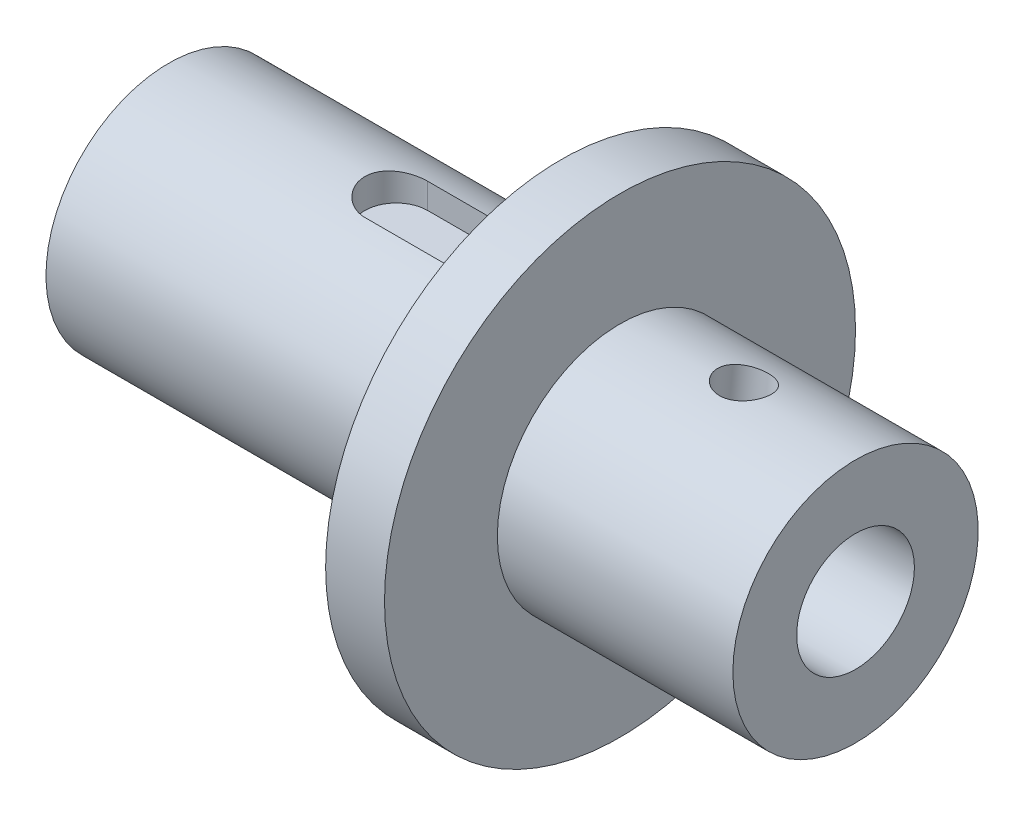
ISO-10303-21;
HEADER;
FILE_DESCRIPTION(('STEP AP214'),'2;1');
FILE_NAME('part.step','',(''),(''),'','','');
FILE_SCHEMA(('AUTOMOTIVE_DESIGN { 1 0 10303 214 1 1 1 1 }'));
ENDSEC;
DATA;
#1=APPLICATION_CONTEXT('core data for automotive mechanical design processes');
#2=APPLICATION_PROTOCOL_DEFINITION('international standard','automotive_design',2000,#1);
#3=PRODUCT_CONTEXT('',#1,'mechanical');
#4=PRODUCT('Part','Part','',(#3));
#5=PRODUCT_RELATED_PRODUCT_CATEGORY('part','',(#4));
#6=PRODUCT_DEFINITION_FORMATION('','',#4);
#7=PRODUCT_DEFINITION_CONTEXT('part definition',#1,'design');
#8=PRODUCT_DEFINITION('design','',#6,#7);
#9=PRODUCT_DEFINITION_SHAPE('','',#8);
#10=(LENGTH_UNIT() NAMED_UNIT(*) SI_UNIT(.MILLI.,.METRE.));
#11=(NAMED_UNIT(*) PLANE_ANGLE_UNIT() SI_UNIT($,.RADIAN.));
#12=(NAMED_UNIT(*) SI_UNIT($,.STERADIAN.) SOLID_ANGLE_UNIT());
#13=UNCERTAINTY_MEASURE_WITH_UNIT(LENGTH_MEASURE(1.E-05),#10,'distance_accuracy_value','');
#14=(GEOMETRIC_REPRESENTATION_CONTEXT(3) GLOBAL_UNCERTAINTY_ASSIGNED_CONTEXT((#13)) GLOBAL_UNIT_ASSIGNED_CONTEXT((#10,
#11,#12)) REPRESENTATION_CONTEXT('',''));
#15=CARTESIAN_POINT('',(0.,0.,0.));
#16=DIRECTION('',(0.,0.,1.));
#17=DIRECTION('',(1.,0.,0.));
#18=AXIS2_PLACEMENT_3D('',#15,#16,#17);
#19=CARTESIAN_POINT('',(12.103012167,0.,0.));
#20=DIRECTION('',(-1.,0.,0.));
#21=DIRECTION('',(0.,-1.,0.));
#22=AXIS2_PLACEMENT_3D('',#19,#20,#21);
#23=CONICAL_SURFACE('',#22,0.,1.02974425859194);
#24=CARTESIAN_POINT('',(12.103012167,0.,0.));
#25=VERTEX_POINT('',#24);
#26=VERTEX_LOOP('',#25);
#27=FACE_BOUND('',#26,.T.);
#28=CARTESIAN_POINT('',(10.,0.,0.));
#29=DIRECTION('',(-1.,0.,0.));
#30=DIRECTION('',(0.,0.,1.));
#31=AXIS2_PLACEMENT_3D('',#28,#29,#30);
#32=CIRCLE('',#31,3.5);
#33=CARTESIAN_POINT('',(10.,0.,3.5));
#34=VERTEX_POINT('',#33);
#35=EDGE_CURVE('E218',#34,#34,#32,.F.);
#36=ORIENTED_EDGE('',*,*,#35,.F.);
#37=EDGE_LOOP('',(#36));
#38=FACE_BOUND('',#37,.T.);
#39=ADVANCED_FACE('F16',(#27,#38),#23,.F.);
#40=CARTESIAN_POINT('',(9.94,4.75,1.6));
#41=DIRECTION('',(0.,-1.,0.));
#42=DIRECTION('',(0.,0.,-1.));
#43=AXIS2_PLACEMENT_3D('',#40,#41,#42);
#44=PLANE('',#43);
#45=CARTESIAN_POINT('',(18.4,4.75,0.));
#46=DIRECTION('',(0.,-1.,0.));
#47=DIRECTION('',(1.,0.,0.));
#48=AXIS2_PLACEMENT_3D('',#45,#46,#47);
#49=CIRCLE('',#48,1.6);
#50=CARTESIAN_POINT('',(18.4,4.75,-1.6));
#51=VERTEX_POINT('',#50);
#52=CARTESIAN_POINT('',(18.3999999996718,4.75,1.6));
#53=VERTEX_POINT('',#52);
#54=EDGE_CURVE('E209',#51,#53,#49,.T.);
#55=ORIENTED_EDGE('',*,*,#54,.F.);
#56=DIRECTION('',(-1.,0.,0.));
#57=VECTOR('',#56,1.);
#58=CARTESIAN_POINT('',(15.,4.75,-1.6));
#59=LINE('',#58,#57);
#60=CARTESIAN_POINT('',(11.5999999998563,4.75,-1.6));
#61=VERTEX_POINT('',#60);
#62=EDGE_CURVE('E60',#51,#61,#59,.T.);
#63=ORIENTED_EDGE('',*,*,#62,.T.);
#64=CARTESIAN_POINT('',(11.6,4.75,0.));
#65=DIRECTION('',(0.,-1.,0.));
#66=DIRECTION('',(1.,0.,0.));
#67=AXIS2_PLACEMENT_3D('',#64,#65,#66);
#68=CIRCLE('',#67,1.6);
#69=CARTESIAN_POINT('',(11.6,4.75,1.6));
#70=VERTEX_POINT('',#69);
#71=EDGE_CURVE('E20',#70,#61,#68,.T.);
#72=ORIENTED_EDGE('',*,*,#71,.F.);
#73=DIRECTION('',(1.,0.,0.));
#74=VECTOR('',#73,1.);
#75=CARTESIAN_POINT('',(15.,4.75,1.6));
#76=LINE('',#75,#74);
#77=EDGE_CURVE('E79',#70,#53,#76,.T.);
#78=ORIENTED_EDGE('',*,*,#77,.T.);
#79=EDGE_LOOP('',(#55,#63,#72,#78));
#80=FACE_BOUND('',#79,.T.);
#81=ADVANCED_FACE('F120',(#80),#44,.F.);
#82=CARTESIAN_POINT('',(10.,0.,0.));
#83=DIRECTION('',(-1.,0.,0.));
#84=DIRECTION('',(0.,-1.,0.));
#85=AXIS2_PLACEMENT_3D('',#82,#83,#84);
#86=CYLINDRICAL_SURFACE('',#85,3.5);
#87=ORIENTED_EDGE('',*,*,#35,.T.);
#88=EDGE_LOOP('',(#87));
#89=FACE_BOUND('',#88,.T.);
#90=CARTESIAN_POINT('',(0.,0.,0.));
#91=DIRECTION('',(-1.,0.,0.));
#92=DIRECTION('',(0.,-1.,0.));
#93=AXIS2_PLACEMENT_3D('',#90,#91,#92);
#94=CIRCLE('',#93,3.5);
#95=CARTESIAN_POINT('',(0.,-3.5,0.));
#96=VERTEX_POINT('',#95);
#97=EDGE_CURVE('E210',#96,#96,#94,.T.);
#98=ORIENTED_EDGE('',*,*,#97,.T.);
#99=EDGE_LOOP('',(#98));
#100=FACE_BOUND('',#99,.T.);
#101=ADVANCED_FACE('F117',(#89,#100),#86,.F.);
#102=CARTESIAN_POINT('',(11.6,4.75,-1.6));
#103=DIRECTION('',(0.,0.,-1.));
#104=DIRECTION('',(0.,1.,0.));
#105=AXIS2_PLACEMENT_3D('',#102,#103,#104);
#106=PLANE('',#105);
#107=DIRECTION('',(0.,1.,0.));
#108=VECTOR('',#107,1.);
#109=CARTESIAN_POINT('',(18.4,5.5045,-1.6));
#110=LINE('',#109,#108);
#111=CARTESIAN_POINT('',(18.4,6.04172988509523,-1.5999999986085));
#112=VERTEX_POINT('',#111);
#113=EDGE_CURVE('E213',#112,#51,#110,.F.);
#114=ORIENTED_EDGE('',*,*,#113,.F.);
#115=DIRECTION('',(1.,0.,0.));
#116=VECTOR('',#115,1.);
#117=CARTESIAN_POINT('',(10.,6.04172988546373,-1.59999999721699));
#118=LINE('',#117,#116);
#119=CARTESIAN_POINT('',(11.5999999998025,6.04172988509523,-1.59999999930425));
#120=VERTEX_POINT('',#119);
#121=EDGE_CURVE('E89',#112,#120,#118,.F.);
#122=ORIENTED_EDGE('',*,*,#121,.T.);
#123=DIRECTION('',(0.,-1.,0.));
#124=VECTOR('',#123,1.);
#125=CARTESIAN_POINT('',(11.5999999997127,5.5045,-1.6));
#126=LINE('',#125,#124);
#127=EDGE_CURVE('E68',#61,#120,#126,.F.);
#128=ORIENTED_EDGE('',*,*,#127,.F.);
#129=ORIENTED_EDGE('',*,*,#62,.F.);
#130=EDGE_LOOP('',(#114,#122,#128,#129));
#131=FACE_BOUND('',#130,.T.);
#132=ADVANCED_FACE('F114',(#131),#106,.F.);
#133=CARTESIAN_POINT('',(11.6,6.259,0.));
#134=DIRECTION('',(0.,-1.,0.));
#135=DIRECTION('',(1.,0.,0.));
#136=AXIS2_PLACEMENT_3D('',#133,#134,#135);
#137=CYLINDRICAL_SURFACE('',#136,1.6);
#138=DIRECTION('',(0.,-1.,0.));
#139=VECTOR('',#138,1.);
#140=CARTESIAN_POINT('',(11.6,5.3958649425,1.6));
#141=LINE('',#140,#139);
#142=CARTESIAN_POINT('',(11.6,6.04172988462339,1.60000000039018));
#143=VERTEX_POINT('',#142);
#144=EDGE_CURVE('E74',#143,#70,#141,.T.);
#145=ORIENTED_EDGE('',*,*,#144,.T.);
#146=ORIENTED_EDGE('',*,*,#71,.T.);
#147=ORIENTED_EDGE('',*,*,#127,.T.);
#148=CARTESIAN_POINT('',(11.5999999998922,6.04172988432471,-1.59999999947766));
#149=CARTESIAN_POINT('',(11.5557761924466,6.04172681998835,-1.60000058063836));
#150=CARTESIAN_POINT('',(11.5115743368598,6.04221606114527,-1.59816531963061));
#151=CARTESIAN_POINT('',(11.423501939716,6.0441475187251,-1.59084948440104));
#152=CARTESIAN_POINT('',(11.3796313417277,6.04558956895065,-1.5853695459149));
#153=CARTESIAN_POINT('',(11.2491787101318,6.05128664570145,-1.56354387092447));
#154=CARTESIAN_POINT('',(11.1634942991287,6.05691296455972,-1.54181191232164));
#155=CARTESIAN_POINT('',(10.9971462253428,6.07116471186792,-1.48469298235488));
#156=CARTESIAN_POINT('',(10.916481951985,6.0797897747514,-1.44930767536543));
#157=CARTESIAN_POINT('',(10.7621921715695,6.09906207670737,-1.3659307828788));
#158=CARTESIAN_POINT('',(10.6885687150988,6.10970990221465,-1.31793553998795));
#159=CARTESIAN_POINT('',(10.5488020061496,6.13210006597814,-1.20953150041553));
#160=CARTESIAN_POINT('',(10.4828447176425,6.14386047186267,-1.14888672792746));
#161=CARTESIAN_POINT('',(10.3619124279948,6.16699526206159,-1.01740759585289));
#162=CARTESIAN_POINT('',(10.3069391915817,6.17836958410342,-0.946571602056747));
#163=CARTESIAN_POINT('',(10.2087712619504,6.19965165002255,-0.795436230713945));
#164=CARTESIAN_POINT('',(10.1657611992738,6.20953543018896,-0.71501326513066));
#165=CARTESIAN_POINT('',(10.0939437435305,6.22651438593658,-0.547787185491661));
#166=CARTESIAN_POINT('',(10.0651334604794,6.23361012888835,-0.4609853738149));
#167=CARTESIAN_POINT('',(10.0231319161723,6.24408566321076,-0.285413561269985));
#168=CARTESIAN_POINT('',(10.0096227210813,6.2475409864945,-0.196724203720504));
#169=CARTESIAN_POINT('',(9.99760793101368,6.25060992112489,-0.0182732189283333));
#170=CARTESIAN_POINT('',(9.99910034460246,6.25022404238376,0.0714882644116628));
#171=CARTESIAN_POINT('',(10.0168200133859,6.24570981389548,0.247323651967181));
#172=CARTESIAN_POINT('',(10.0327036540762,6.24166874175723,0.333434763369542));
#173=CARTESIAN_POINT('',(10.0782014172958,6.23040035198614,0.501725414121636));
#174=CARTESIAN_POINT('',(10.1078161636171,6.22317288959914,0.583904774668287));
#175=CARTESIAN_POINT('',(10.1802086555579,6.2062116261756,0.742896354208404));
#176=CARTESIAN_POINT('',(10.2231072403234,6.19645495612802,0.819651012147));
#177=CARTESIAN_POINT('',(10.3207568884092,6.17549144575384,0.964989633533756));
#178=CARTESIAN_POINT('',(10.375509839934,6.16428437451683,1.0335722926164));
#179=CARTESIAN_POINT('',(10.4971421771756,6.14126503423738,1.16266481600372));
#180=CARTESIAN_POINT('',(10.5643204114643,6.12944461221689,1.22289192620875));
#181=CARTESIAN_POINT('',(10.7079659564706,6.10681624863925,1.33130465043616));
#182=CARTESIAN_POINT('',(10.7844358085888,6.0960085855254,1.37948695895264));
#183=CARTESIAN_POINT('',(10.9450817636181,6.07659665729782,1.46263931350084));
#184=CARTESIAN_POINT('',(11.0293001681628,6.06800559621486,1.49753074830726));
#185=CARTESIAN_POINT('',(11.2026319549541,6.05417058222458,1.55252575213169));
#186=CARTESIAN_POINT('',(11.2917377922956,6.04892161963159,1.57265146137153));
#187=CARTESIAN_POINT('',(11.4180187991308,6.04436067125665,1.59003843258497));
#188=CARTESIAN_POINT('',(11.4543374169817,6.04337571668329,1.59377456081873));
#189=CARTESIAN_POINT('',(11.5270982255903,6.04206057703251,1.59875259411566));
#190=CARTESIAN_POINT('',(11.5635401232575,6.04172934033848,1.59999850515874));
#191=CARTESIAN_POINT('',(11.6000000000159,6.04172988472672,1.6));
#192=B_SPLINE_CURVE_WITH_KNOTS('',3,(#148,#149,#150,#151,#152,#153,#154,#155,#156,#157,#158,
#159,#160,#161,#162,#163,#164,#165,#166,#167,#168,#169,#170,#171,#172,#173,#174,#175,#176,#177,
#178,#179,#180,#181,#182,#183,#184,#185,#186,#187,#188,#189,#190,#191),.UNSPECIFIED.,.F.,.F.,(4,
2,2,2,2,2,2,2,2,2,2,2,2,2,2,2,2,2,2,2,2,4),(0.,0.132587489921271,0.26515185886682,
0.529506235632429,0.793828397169026,1.05822730766522,1.32808864549373,1.59799330517167,
1.87185763919818,2.14566621244113,2.41367462580973,2.68164746204973,2.9433858988442,
3.20513622734869,3.46934127251113,3.73358843217079,4.00529978668743,4.27708562644268,
4.55045491352495,4.82341345913667,4.9329108850557,5.04223202166154),.UNSPECIFIED.);
#193=EDGE_CURVE('E83',#120,#143,#192,.T.);
#194=ORIENTED_EDGE('',*,*,#193,.T.);
#195=EDGE_LOOP('',(#145,#146,#147,#194));
#196=FACE_BOUND('',#195,.T.);
#197=ADVANCED_FACE('F88',(#196),#137,.F.);
#198=CARTESIAN_POINT('',(11.6,6.041729885,1.6));
#199=DIRECTION('',(0.,0.,1.));
#200=DIRECTION('',(0.,-1.,0.));
#201=AXIS2_PLACEMENT_3D('',#198,#199,#200);
#202=PLANE('',#201);
#203=DIRECTION('',(0.,-1.,0.));
#204=VECTOR('',#203,1.);
#205=CARTESIAN_POINT('',(18.3999999993437,5.5045,1.6));
#206=LINE('',#205,#204);
#207=CARTESIAN_POINT('',(18.3999999995488,6.04172988462339,1.60000000019509));
#208=VERTEX_POINT('',#207);
#209=EDGE_CURVE('E208',#53,#208,#206,.F.);
#210=ORIENTED_EDGE('',*,*,#209,.F.);
#211=ORIENTED_EDGE('',*,*,#77,.F.);
#212=ORIENTED_EDGE('',*,*,#144,.F.);
#213=DIRECTION('',(-1.,0.,0.));
#214=VECTOR('',#213,1.);
#215=CARTESIAN_POINT('',(10.,6.04172988452006,1.60000000078037));
#216=LINE('',#215,#214);
#217=EDGE_CURVE('E78',#143,#208,#216,.F.);
#218=ORIENTED_EDGE('',*,*,#217,.T.);
#219=EDGE_LOOP('',(#210,#211,#212,#218));
#220=FACE_BOUND('',#219,.T.);
#221=ADVANCED_FACE('F77',(#220),#202,.F.);
#222=CARTESIAN_POINT('',(18.4,6.259,0.));
#223=DIRECTION('',(0.,-1.,0.));
#224=DIRECTION('',(1.,0.,0.));
#225=AXIS2_PLACEMENT_3D('',#222,#223,#224);
#226=CYLINDRICAL_SURFACE('',#225,1.6);
#227=ORIENTED_EDGE('',*,*,#209,.T.);
#228=CARTESIAN_POINT('',(18.3999999997539,6.04172988472672,1.6));
#229=CARTESIAN_POINT('',(18.4442252437646,6.04172681935809,1.60000058071497));
#230=CARTESIAN_POINT('',(18.4884285361978,6.04221609265232,1.59816520019615));
#231=CARTESIAN_POINT('',(18.5765037702702,6.04414767535478,1.59084889079733));
#232=CARTESIAN_POINT('',(18.6203757683835,6.04558981844555,1.58536859811283));
#233=CARTESIAN_POINT('',(18.750826867573,6.05128701027557,1.56354245695758));
#234=CARTESIAN_POINT('',(18.8365084072781,6.05691319634807,1.54181097336296));
#235=CARTESIAN_POINT('',(19.0028525068043,6.07116460332659,1.48469342735641));
#236=CARTESIAN_POINT('',(19.083515590497,6.07978951057769,1.44930879297));
#237=CARTESIAN_POINT('',(19.2378056000443,6.0990617555275,1.36593219746827));
#238=CARTESIAN_POINT('',(19.3114302615877,6.10970974079581,1.31793619767597));
#239=CARTESIAN_POINT('',(19.4511969337215,6.13209989358457,1.2095324614657));
#240=CARTESIAN_POINT('',(19.5171532493549,6.14386010192705,1.14888910437424));
#241=CARTESIAN_POINT('',(19.6380860433759,6.16699495092037,1.01740909159002));
#242=CARTESIAN_POINT('',(19.6930604344795,6.17836951793369,0.946570502529934));
#243=CARTESIAN_POINT('',(19.7912427639658,6.19965467561516,0.795416337254771));
#244=CARTESIAN_POINT('',(19.8342624974552,6.20954083631325,0.714974907464192));
#245=CARTESIAN_POINT('',(19.9060744713592,6.22651889069355,0.547727959551473));
#246=CARTESIAN_POINT('',(19.9348778502541,6.23361297107836,0.460927485162236));
#247=CARTESIAN_POINT('',(19.9706552481646,6.24253611579442,0.311391289185376));
#248=CARTESIAN_POINT('',(19.9816419953275,6.24531855883619,0.249642895903449));
#249=CARTESIAN_POINT('',(19.9963191885434,6.24905766568499,0.125274030424995));
#250=CARTESIAN_POINT('',(20.0000145519229,6.25001555995694,0.0626541746654029));
#251=CARTESIAN_POINT('',(20.,6.25,-6.40947607685294E-10));
#252=B_SPLINE_CURVE_WITH_KNOTS('',3,(#228,#229,#230,#231,#232,#233,#234,#235,#236,#237,#238,
#239,#240,#241,#242,#243,#244,#245,#246,#247,#248,#249,#250,#251),.UNSPECIFIED.,.F.,.F.,(4,2,2,
2,2,2,2,2,2,2,2,4),(0.,0.132591796333495,0.26516045571009,0.529506258667722,0.793824420367086,
1.05822733097571,1.32808470876535,1.59799332840719,1.87193727334603,2.14566624178149,
2.33357502637954,2.52135704147259),.UNSPECIFIED.);
#253=CARTESIAN_POINT('',(20.,6.25,-6.40946634980567E-10));
#254=VERTEX_POINT('',#253);
#255=EDGE_CURVE('E86',#208,#254,#252,.T.);
#256=ORIENTED_EDGE('',*,*,#255,.T.);
#257=CARTESIAN_POINT('',(20.,6.25,-6.40946683968078E-10));
#258=CARTESIAN_POINT('',(20.0000005161681,6.2500025791623,-0.0442493130808318));
#259=CARTESIAN_POINT('',(19.9981631980636,6.24952950560536,-0.0884767546108638));
#260=CARTESIAN_POINT('',(19.990838751429,6.24765951576339,-0.176601659652955));
#261=CARTESIAN_POINT('',(19.9853522086805,6.24626274775206,-0.220499174981966));
#262=CARTESIAN_POINT('',(19.9634989956066,6.24073855860704,-0.351035894575359));
#263=CARTESIAN_POINT('',(19.9417383857182,6.235276934396,-0.436779327251071));
#264=CARTESIAN_POINT('',(19.8845361180179,6.22138142052395,-0.603250781418871));
#265=CARTESIAN_POINT('',(19.8490950401602,6.21294765686175,-0.683979015351177));
#266=CARTESIAN_POINT('',(19.7655864191011,6.1940032883892,-0.838377146237586));
#267=CARTESIAN_POINT('',(19.7175153453696,6.18349210306995,-0.912045061712377));
#268=CARTESIAN_POINT('',(19.609034125669,6.16128215439174,-1.05176517817468));
#269=CARTESIAN_POINT('',(19.5484053131104,6.1495645034444,-1.11764452045923));
#270=CARTESIAN_POINT('',(19.416986407459,6.12638439341584,-1.23842820687321));
#271=CARTESIAN_POINT('',(19.3461940342909,6.1149219922652,-1.29333008170652));
#272=CARTESIAN_POINT('',(19.1950844491892,6.09335592126694,-1.39143271986651));
#273=CARTESIAN_POINT('',(19.1146333562695,6.08327683202516,-1.43443293963199));
#274=CARTESIAN_POINT('',(18.9473677047683,6.06590612988119,-1.50620531479238));
#275=CARTESIAN_POINT('',(18.8605584454515,6.05861222645372,-1.53498916741076));
#276=CARTESIAN_POINT('',(18.7110751833261,6.04942831864308,-1.57071499156498));
#277=CARTESIAN_POINT('',(18.6493929452108,6.04656033773115,-1.58167872257819));
#278=CARTESIAN_POINT('',(18.5251517747055,6.04270282468231,-1.59632635000043));
#279=CARTESIAN_POINT('',(18.4625934004119,6.04171214704809,-1.60001468578339));
#280=CARTESIAN_POINT('',(18.400000000101,6.04172988472672,-1.6));
#281=B_SPLINE_CURVE_WITH_KNOTS('',3,(#257,#258,#259,#260,#261,#262,#263,#264,#265,#266,#267,
#268,#269,#270,#271,#272,#273,#274,#275,#276,#277,#278,#279,#280),.UNSPECIFIED.,.F.,.F.,(4,2,2,
2,2,2,2,2,2,2,2,4),(0.,0.132664225363,0.265307160306465,0.529823039695571,0.794327706731223,
1.05890639098156,1.32855180997544,1.59825781554553,1.87226450230523,2.14604535927402,
2.3337582977726,2.52135666022402),.UNSPECIFIED.);
#282=EDGE_CURVE('E91',#254,#112,#281,.T.);
#283=ORIENTED_EDGE('',*,*,#282,.T.);
#284=ORIENTED_EDGE('',*,*,#113,.T.);
#285=ORIENTED_EDGE('',*,*,#54,.T.);
#286=EDGE_LOOP('',(#227,#256,#283,#284,#285));
#287=FACE_BOUND('',#286,.T.);
#288=ADVANCED_FACE('F115',(#287),#226,.F.);
#289=CARTESIAN_POINT('',(0.,-6.325,6.325));
#290=DIRECTION('',(1.,0.,0.));
#291=DIRECTION('',(0.,0.,-1.));
#292=AXIS2_PLACEMENT_3D('',#289,#290,#291);
#293=PLANE('',#292);
#294=ORIENTED_EDGE('',*,*,#97,.F.);
#295=EDGE_LOOP('',(#294));
#296=FACE_BOUND('',#295,.T.);
#297=CARTESIAN_POINT('',(0.,0.,0.));
#298=DIRECTION('',(-1.,0.,0.));
#299=DIRECTION('',(0.,-1.,0.));
#300=AXIS2_PLACEMENT_3D('',#297,#298,#299);
#301=CIRCLE('',#300,6.25);
#302=CARTESIAN_POINT('',(0.,-6.25000000000001,0.));
#303=VERTEX_POINT('',#302);
#304=EDGE_CURVE('E201',#303,#303,#301,.T.);
#305=ORIENTED_EDGE('',*,*,#304,.T.);
#306=EDGE_LOOP('',(#305));
#307=FACE_BOUND('',#306,.T.);
#308=ADVANCED_FACE('F131',(#296,#307),#293,.F.);
#309=CARTESIAN_POINT('',(20.,0.,0.));
#310=DIRECTION('',(-1.,0.,0.));
#311=DIRECTION('',(0.,-1.,0.));
#312=AXIS2_PLACEMENT_3D('',#309,#310,#311);
#313=CYLINDRICAL_SURFACE('',#312,6.25);
#314=ORIENTED_EDGE('',*,*,#304,.F.);
#315=EDGE_LOOP('',(#314));
#316=FACE_BOUND('',#315,.T.);
#317=CARTESIAN_POINT('',(20.,0.,0.));
#318=DIRECTION('',(-1.,0.,0.));
#319=DIRECTION('',(0.,-1.,0.));
#320=AXIS2_PLACEMENT_3D('',#317,#318,#319);
#321=CIRCLE('',#320,6.25);
#322=EDGE_CURVE('E35',#254,#254,#321,.T.);
#323=ORIENTED_EDGE('',*,*,#322,.T.);
#324=ORIENTED_EDGE('',*,*,#255,.F.);
#325=ORIENTED_EDGE('',*,*,#217,.F.);
#326=ORIENTED_EDGE('',*,*,#193,.F.);
#327=ORIENTED_EDGE('',*,*,#121,.F.);
#328=ORIENTED_EDGE('',*,*,#282,.F.);
#329=EDGE_LOOP('',(#323,#324,#325,#326,#327,#328));
#330=FACE_BOUND('',#329,.T.);
#331=ADVANCED_FACE('F81',(#316,#330),#313,.T.);
#332=CARTESIAN_POINT('',(20.,-12.144,12.144));
#333=DIRECTION('',(1.,0.,0.));
#334=DIRECTION('',(0.,0.,-1.));
#335=AXIS2_PLACEMENT_3D('',#332,#333,#334);
#336=PLANE('',#335);
#337=ORIENTED_EDGE('',*,*,#322,.F.);
#338=EDGE_LOOP('',(#337));
#339=FACE_BOUND('',#338,.T.);
#340=CARTESIAN_POINT('',(20.,0.,0.));
#341=DIRECTION('',(-1.,0.,0.));
#342=DIRECTION('',(0.,0.,1.));
#343=AXIS2_PLACEMENT_3D('',#340,#341,#342);
#344=CIRCLE('',#343,12.);
#345=CARTESIAN_POINT('',(20.,0.,12.));
#346=VERTEX_POINT('',#345);
#347=EDGE_CURVE('E189',#346,#346,#344,.T.);
#348=ORIENTED_EDGE('',*,*,#347,.T.);
#349=EDGE_LOOP('',(#348));
#350=FACE_BOUND('',#349,.T.);
#351=ADVANCED_FACE('F135',(#339,#350),#336,.F.);
#352=CARTESIAN_POINT('',(23.,0.,0.));
#353=DIRECTION('',(-1.,0.,0.));
#354=DIRECTION('',(0.,0.,1.));
#355=AXIS2_PLACEMENT_3D('',#352,#353,#354);
#356=CYLINDRICAL_SURFACE('',#355,12.);
#357=ORIENTED_EDGE('',*,*,#347,.F.);
#358=EDGE_LOOP('',(#357));
#359=FACE_BOUND('',#358,.T.);
#360=CARTESIAN_POINT('',(23.,0.,0.));
#361=DIRECTION('',(-1.,0.,0.));
#362=DIRECTION('',(0.,0.,1.));
#363=AXIS2_PLACEMENT_3D('',#360,#361,#362);
#364=CIRCLE('',#363,12.);
#365=CARTESIAN_POINT('',(23.,0.,12.));
#366=VERTEX_POINT('',#365);
#367=EDGE_CURVE('E192',#366,#366,#364,.T.);
#368=ORIENTED_EDGE('',*,*,#367,.T.);
#369=EDGE_LOOP('',(#368));
#370=FACE_BOUND('',#369,.T.);
#371=ADVANCED_FACE('F138',(#359,#370),#356,.T.);
#372=CARTESIAN_POINT('',(19.,-3.036,3.036));
#373=DIRECTION('',(1.,0.,0.));
#374=DIRECTION('',(0.,0.,-1.));
#375=AXIS2_PLACEMENT_3D('',#372,#373,#374);
#376=PLANE('',#375);
#377=CARTESIAN_POINT('',(19.,0.,0.));
#378=DIRECTION('',(1.,0.,0.));
#379=DIRECTION('',(0.,0.,-1.));
#380=AXIS2_PLACEMENT_3D('',#377,#378,#379);
#381=CIRCLE('',#380,3.);
#382=CARTESIAN_POINT('',(19.,0.,-3.));
#383=VERTEX_POINT('',#382);
#384=EDGE_CURVE('E193',#383,#383,#381,.F.);
#385=ORIENTED_EDGE('',*,*,#384,.F.);
#386=EDGE_LOOP('',(#385));
#387=FACE_BOUND('',#386,.T.);
#388=ADVANCED_FACE('F140',(#387),#376,.T.);
#389=CARTESIAN_POINT('',(23.,-12.144,-12.144));
#390=DIRECTION('',(-1.,0.,0.));
#391=DIRECTION('',(0.,0.,1.));
#392=AXIS2_PLACEMENT_3D('',#389,#390,#391);
#393=PLANE('',#392);
#394=CARTESIAN_POINT('',(23.,0.,0.));
#395=DIRECTION('',(-1.,0.,0.));
#396=DIRECTION('',(0.,0.,1.));
#397=AXIS2_PLACEMENT_3D('',#394,#395,#396);
#398=CIRCLE('',#397,6.25);
#399=CARTESIAN_POINT('',(23.,0.,6.25));
#400=VERTEX_POINT('',#399);
#401=EDGE_CURVE('E332',#400,#400,#398,.T.);
#402=ORIENTED_EDGE('',*,*,#401,.T.);
#403=EDGE_LOOP('',(#402));
#404=FACE_BOUND('',#403,.T.);
#405=ORIENTED_EDGE('',*,*,#367,.F.);
#406=EDGE_LOOP('',(#405));
#407=FACE_BOUND('',#406,.T.);
#408=ADVANCED_FACE('F142',(#404,#407),#393,.F.);
#409=CARTESIAN_POINT('',(35.,-6.325,-6.325));
#410=DIRECTION('',(-1.,0.,0.));
#411=DIRECTION('',(0.,0.,1.));
#412=AXIS2_PLACEMENT_3D('',#409,#410,#411);
#413=PLANE('',#412);
#414=CARTESIAN_POINT('',(35.,0.,0.));
#415=DIRECTION('',(1.,0.,0.));
#416=DIRECTION('',(0.,0.,-1.));
#417=AXIS2_PLACEMENT_3D('',#414,#415,#416);
#418=CIRCLE('',#417,3.);
#419=CARTESIAN_POINT('',(35.,0.,-3.));
#420=VERTEX_POINT('',#419);
#421=EDGE_CURVE('E196',#420,#420,#418,.T.);
#422=ORIENTED_EDGE('',*,*,#421,.F.);
#423=EDGE_LOOP('',(#422));
#424=FACE_BOUND('',#423,.T.);
#425=CARTESIAN_POINT('',(35.,0.,0.));
#426=DIRECTION('',(-1.,0.,0.));
#427=DIRECTION('',(0.,0.,1.));
#428=AXIS2_PLACEMENT_3D('',#425,#426,#427);
#429=CIRCLE('',#428,6.25);
#430=CARTESIAN_POINT('',(35.,0.,6.25));
#431=VERTEX_POINT('',#430);
#432=EDGE_CURVE('E177',#431,#431,#429,.F.);
#433=ORIENTED_EDGE('',*,*,#432,.T.);
#434=EDGE_LOOP('',(#433));
#435=FACE_BOUND('',#434,.T.);
#436=ADVANCED_FACE('F18',(#424,#435),#413,.F.);
#437=CARTESIAN_POINT('',(19.,0.,0.));
#438=DIRECTION('',(1.,0.,0.));
#439=DIRECTION('',(0.,0.,-1.));
#440=AXIS2_PLACEMENT_3D('',#437,#438,#439);
#441=CYLINDRICAL_SURFACE('',#440,3.);
#442=ORIENTED_EDGE('',*,*,#384,.T.);
#443=EDGE_LOOP('',(#442));
#444=FACE_BOUND('',#443,.T.);
#445=ORIENTED_EDGE('',*,*,#421,.T.);
#446=EDGE_LOOP('',(#445));
#447=FACE_BOUND('',#446,.T.);
#448=CARTESIAN_POINT('',(28.6729558909102,2.84215465608728,0.960290014653018));
#449=CARTESIAN_POINT('',(28.6062119804907,2.84215858822566,0.960285433220162));
#450=CARTESIAN_POINT('',(28.5394113486349,2.84406667022996,0.954687509490999));
#451=CARTESIAN_POINT('',(28.4077958107473,2.8513970128495,0.932557416886779));
#452=CARTESIAN_POINT('',(28.3429839619859,2.8568244253813,0.916009217271825));
#453=CARTESIAN_POINT('',(28.2174027141767,2.87031840196038,0.872799066031478));
#454=CARTESIAN_POINT('',(28.1566196481407,2.87837542906939,0.846173607147348));
#455=CARTESIAN_POINT('',(28.0402148421802,2.89598922742281,0.783768973547764));
#456=CARTESIAN_POINT('',(27.984593532075,2.90554612338329,0.747989037469443));
#457=CARTESIAN_POINT('',(27.8766279416612,2.9254530245957,0.666031423722757));
#458=CARTESIAN_POINT('',(27.8246444470892,2.93581738989922,0.619381773422013));
#459=CARTESIAN_POINT('',(27.7287524749112,2.95535930317042,0.518175772363154));
#460=CARTESIAN_POINT('',(27.6848465137054,2.96453648102927,0.463616967092414));
#461=CARTESIAN_POINT('',(27.6045066077753,2.98067660010954,0.345362234033525));
#462=CARTESIAN_POINT('',(27.5684797143612,2.98752614000877,0.281372494057642));
#463=CARTESIAN_POINT('',(27.5076801865288,2.99709343140407,0.147962567232947));
#464=CARTESIAN_POINT('',(27.4829026972951,2.99981296644382,0.0785447381321278));
#465=CARTESIAN_POINT('',(27.4466164410709,3.00015902285688,-0.0598414434043309));
#466=CARTESIAN_POINT('',(27.434484209355,2.99804324755762,-0.128645152692184));
#467=CARTESIAN_POINT('',(27.4218182509916,2.9888992444619,-0.266980431842222));
#468=CARTESIAN_POINT('',(27.4212798330744,2.98187300480238,-0.336511695914921));
#469=CARTESIAN_POINT('',(27.4314901718976,2.96369893334821,-0.469832638344438));
#470=CARTESIAN_POINT('',(27.4415539924137,2.95282796333234,-0.53371421169309));
#471=CARTESIAN_POINT('',(27.4715090056532,2.92755359000028,-0.658390141048438));
#472=CARTESIAN_POINT('',(27.4914009185844,2.91314992784556,-0.719184270445552));
#473=CARTESIAN_POINT('',(27.5406843396609,2.88149249648658,-0.83713193845086));
#474=CARTESIAN_POINT('',(27.5702163062125,2.86419855443428,-0.894215686298143));
#475=CARTESIAN_POINT('',(27.6378029928525,2.82809842786277,-1.0025592263255));
#476=CARTESIAN_POINT('',(27.6758604367593,2.80929176127431,-1.05381714929671));
#477=CARTESIAN_POINT('',(27.7625322362133,2.77014088071534,-1.15297795458392));
#478=CARTESIAN_POINT('',(27.811701005601,2.74978159512894,-1.20039095320854));
#479=CARTESIAN_POINT('',(27.9176531867181,2.7105184868884,-1.28659980541246));
#480=CARTESIAN_POINT('',(27.9744415037945,2.69161561429534,-1.32539006470657));
#481=CARTESIAN_POINT('',(28.0963934897376,2.65644609081584,-1.39458013002586));
#482=CARTESIAN_POINT('',(28.1617739525585,2.64028892472468,-1.42465544283669));
#483=CARTESIAN_POINT('',(28.2975522448878,2.61329485161351,-1.47359531373276));
#484=CARTESIAN_POINT('',(28.3679388094926,2.60244640704657,-1.49248420245454));
#485=CARTESIAN_POINT('',(28.4780244311362,2.59093723915577,-1.51231643809409));
#486=CARTESIAN_POINT('',(28.5167571950188,2.58788488566508,-1.51752038889922));
#487=CARTESIAN_POINT('',(28.5946387631578,2.58379616559371,-1.52447157634706));
#488=CARTESIAN_POINT('',(28.6337875597828,2.58275976209752,-1.52621887628701));
#489=CARTESIAN_POINT('',(28.7396998009334,2.58276736790079,-1.52621305046791));
#490=CARTESIAN_POINT('',(28.8065004327464,2.5857897430966,-1.5211294716426));
#491=CARTESIAN_POINT('',(28.9381159706657,2.59752976692979,-1.50098879778315));
#492=CARTESIAN_POINT('',(29.0029278195021,2.60625576520001,-1.48591708049005));
#493=CARTESIAN_POINT('',(29.1285090672462,2.62837750429812,-1.44642235638458));
#494=CARTESIAN_POINT('',(29.1892921331422,2.64175638165699,-1.42203308822571));
#495=CARTESIAN_POINT('',(29.3056969391692,2.67187085812785,-1.36460746253179));
#496=CARTESIAN_POINT('',(29.3613182494802,2.6886067364115,-1.33157038576632));
#497=CARTESIAN_POINT('',(29.4692838399144,2.72500055393506,-1.25548605627413));
#498=CARTESIAN_POINT('',(29.5212673342776,2.74476995620865,-1.21197995673558));
#499=CARTESIAN_POINT('',(29.6171593065412,2.78477938932256,-1.11698634492599));
#500=CARTESIAN_POINT('',(29.6610652680421,2.80501956461857,-1.06549635460293));
#501=CARTESIAN_POINT('',(29.7414051740428,2.84521919742437,-0.953118977723232));
#502=CARTESIAN_POINT('',(29.7774320672057,2.86512833622683,-0.891920699707012));
#503=CARTESIAN_POINT('',(29.8382315951671,2.90202459647107,-0.763357844908634));
#504=CARTESIAN_POINT('',(29.8630090847806,2.91901297643087,-0.695995943221681));
#505=CARTESIAN_POINT('',(29.8992953410754,2.94791361108168,-0.56066077297701));
#506=CARTESIAN_POINT('',(29.9114275725158,2.96004403919675,-0.492901790981221));
#507=CARTESIAN_POINT('',(29.9240935309902,2.97964843853057,-0.355657738996826));
#508=CARTESIAN_POINT('',(29.924631949294,2.98712429196682,-0.286173378552608));
#509=CARTESIAN_POINT('',(29.9144216105274,2.99685812170922,-0.151971951139613));
#510=CARTESIAN_POINT('',(29.9043577897257,2.99940596523764,-0.0872221102767034));
#511=CARTESIAN_POINT('',(29.8744027765475,3.00040809360937,0.0399858968212088));
#512=CARTESIAN_POINT('',(29.8545108639635,2.99886207841639,0.10244389474838));
#513=CARTESIAN_POINT('',(29.8052274429725,2.99222991171951,0.224385928973072));
#514=CARTESIAN_POINT('',(29.7756954761521,2.98709004795879,0.283809968589804));
#515=CARTESIAN_POINT('',(29.7081087895465,2.97412861048768,0.397271605097283));
#516=CARTESIAN_POINT('',(29.6700513459431,2.96630617929464,0.451307472521226));
#517=CARTESIAN_POINT('',(29.5833795466066,2.94846441538014,0.55641374358339));
#518=CARTESIAN_POINT('',(29.5342107769974,2.93832922667099,0.607007921854334));
#519=CARTESIAN_POINT('',(29.4282585959004,2.91770445052919,0.699464270977312));
#520=CARTESIAN_POINT('',(29.3714702790657,2.90721463807689,0.741320771907988));
#521=CARTESIAN_POINT('',(29.2495182932197,2.8870827383604,0.816279875024213));
#522=CARTESIAN_POINT('',(29.1841378302401,2.87748080524495,0.849042373657428));
#523=CARTESIAN_POINT('',(29.0483595378955,2.86116881900309,0.902499927595118));
#524=CARTESIAN_POINT('',(28.9779729734339,2.8544524984334,0.92322117094949));
#525=CARTESIAN_POINT('',(28.8678873515555,2.84728438146798,0.945001818583857));
#526=CARTESIAN_POINT('',(28.8291545873923,2.84537181050758,0.950723709520437));
#527=CARTESIAN_POINT('',(28.7512730187449,2.84280580556762,0.958369117073739));
#528=CARTESIAN_POINT('',(28.7121242218921,2.84215234853148,0.960292703244041));
#529=CARTESIAN_POINT('',(28.6729558909102,2.84215465608728,0.960290014653018));
#530=B_SPLINE_CURVE_WITH_KNOTS('',3,(#448,#449,#450,#451,#452,#453,#454,#455,#456,#457,#458,
#459,#460,#461,#462,#463,#464,#465,#466,#467,#468,#469,#470,#471,#472,#473,#474,#475,#476,#477,
#478,#479,#480,#481,#482,#483,#484,#485,#486,#487,#488,#489,#490,#491,#492,#493,#494,#495,#496,
#497,#498,#499,#500,#501,#502,#503,#504,#505,#506,#507,#508,#509,#510,#511,#512,#513,#514,#515,
#516,#517,#518,#519,#520,#521,#522,#523,#524,#525,#526,#527,#528,#529),.UNSPECIFIED.,.T.,.F.,(4,
2,2,2,2,2,2,2,2,2,2,2,2,2,2,2,2,2,2,2,2,2,2,2,2,2,2,2,2,2,2,2,2,2,2,2,2,2,2,2,4),(0.,
0.200076795829988,0.400447145543111,0.600098731677161,0.799766927907044,1.01067616414345,
1.2216509942442,1.44178337131826,1.66182065710738,1.87040592912353,2.07890679852732,
2.27471843430028,2.47054442137914,2.66936150467123,2.86824219917374,3.08111744093762,
3.29413039200628,3.51427696364729,3.73394293778636,3.85135915703463,3.96877322616936,
4.16885002194111,4.36922037157845,4.56887195767876,4.76854015389939,4.97944939014014,
5.19042422023043,5.41055659736437,5.63059388321998,5.83917915532133,6.04768002480758,
6.24349166061696,6.43931764773335,6.63813473101648,6.83701542550783,7.04989066724726,
7.2629036182982,7.48305018996674,7.70271616412248,7.82013238410018,7.93754645396235),.UNSPECIFIED.);
#531=CARTESIAN_POINT('',(28.6729558909102,2.84215465608728,0.960290014653018));
#532=VERTEX_POINT('',#531);
#533=EDGE_CURVE('E26',#532,#532,#530,.T.);
#534=ORIENTED_EDGE('',*,*,#533,.F.);
#535=EDGE_LOOP('',(#534));
#536=FACE_BOUND('',#535,.T.);
#537=ADVANCED_FACE('F150',(#444,#447,#536),#441,.F.);
#538=CARTESIAN_POINT('',(35.,0.,0.));
#539=DIRECTION('',(-1.,0.,0.));
#540=DIRECTION('',(0.,0.,1.));
#541=AXIS2_PLACEMENT_3D('',#538,#539,#540);
#542=CYLINDRICAL_SURFACE('',#541,6.25);
#543=ORIENTED_EDGE('',*,*,#401,.F.);
#544=EDGE_LOOP('',(#543));
#545=FACE_BOUND('',#544,.T.);
#546=ORIENTED_EDGE('',*,*,#432,.F.);
#547=EDGE_LOOP('',(#546));
#548=FACE_BOUND('',#547,.T.);
#549=CARTESIAN_POINT('',(28.6729558904872,5.96097670487534,-1.87863160942574));
#550=CARTESIAN_POINT('',(28.6035728337542,5.96097877392971,-1.87862846752274));
#551=CARTESIAN_POINT('',(28.5341035421025,5.962765388252,-1.87298492584018));
#552=CARTESIAN_POINT('',(28.3970745826972,5.9697643699761,-1.85055284708025));
#553=CARTESIAN_POINT('',(28.3295189814807,5.9749835339135,-1.83374219818178));
#554=CARTESIAN_POINT('',(28.1984025389616,5.988386291605,-1.78948597965667));
#555=CARTESIAN_POINT('',(28.1348360524548,5.99656558001125,-1.76205585149239));
#556=CARTESIAN_POINT('',(28.013346002293,6.01520550490922,-1.69733071362783));
#557=CARTESIAN_POINT('',(27.9554206024811,6.02566539545708,-1.66003892865078));
#558=CARTESIAN_POINT('',(27.846006273283,6.04818692812678,-1.57602198579944));
#559=CARTESIAN_POINT('',(27.794609187725,6.06026735327861,-1.52918222649595));
#560=CARTESIAN_POINT('',(27.7005112018406,6.08500227643305,-1.42757708457724));
#561=CARTESIAN_POINT('',(27.6578113730855,6.09765684494013,-1.37281072676214));
#562=CARTESIAN_POINT('',(27.5819707177568,6.12273595757448,-1.2562575343289));
#563=CARTESIAN_POINT('',(27.5489162212954,6.1351575455124,-1.19441380520673));
#564=CARTESIAN_POINT('',(27.4938620299058,6.15880625208377,-1.06577515713933));
#565=CARTESIAN_POINT('',(27.471861206896,6.17003349251402,-0.998980744234405));
#566=CARTESIAN_POINT('',(27.4398219119737,6.19047444471167,-0.863234176871984));
#567=CARTESIAN_POINT('',(27.4296296845136,6.19971273143429,-0.794322034718324));
#568=CARTESIAN_POINT('',(27.4210171988316,6.21592255191524,-0.655505717562677));
#569=CARTESIAN_POINT('',(27.4225958244599,6.22289430052849,-0.585601637246809));
#570=CARTESIAN_POINT('',(27.4373635872657,6.23431222198247,-0.44784238767997));
#571=CARTESIAN_POINT('',(27.4503870091056,6.2387929575947,-0.379972216612542));
#572=CARTESIAN_POINT('',(27.4874120046779,6.24546435014193,-0.247179658901579));
#573=CARTESIAN_POINT('',(27.5114141004752,6.24765489815619,-0.18225741260105));
#574=CARTESIAN_POINT('',(27.5698695002663,6.2500596109647,-0.0567661385311822));
#575=CARTESIAN_POINT('',(27.6043880499874,6.25026116734495,0.00377270582826845));
#576=CARTESIAN_POINT('',(27.6828455440276,6.24914193743585,0.118383043553365));
#577=CARTESIAN_POINT('',(27.7267848815076,6.24782108760136,0.172454266856874));
#578=CARTESIAN_POINT('',(27.8237372481211,6.24422054091728,0.273524275531053));
#579=CARTESIAN_POINT('',(27.8768937311088,6.2419246961012,0.320384963060393));
#580=CARTESIAN_POINT('',(27.9903267231377,6.2370360299677,0.404555864246496));
#581=CARTESIAN_POINT('',(28.0506063821397,6.23444307728082,0.441861829409832));
#582=CARTESIAN_POINT('',(28.1767911748534,6.22957855843039,0.505853686131683));
#583=CARTESIAN_POINT('',(28.2427122443168,6.22730795431327,0.532508201030178));
#584=CARTESIAN_POINT('',(28.3780727464003,6.22361020061655,0.574125011618084));
#585=CARTESIAN_POINT('',(28.4475044287485,6.22218127420154,0.589111959973957));
#586=CARTESIAN_POINT('',(28.5433802490694,6.22100720171997,0.601311645093621));
#587=CARTESIAN_POINT('',(28.5692300884754,6.22076873583007,0.603770754085386));
#588=CARTESIAN_POINT('',(28.6210345559638,6.22044927019175,0.607053151583485));
#589=CARTESIAN_POINT('',(28.6469891842303,6.22036827072019,0.607876437213652));
#590=CARTESIAN_POINT('',(28.7423389476456,6.22037016174719,0.607871625484015));
#591=CARTESIAN_POINT('',(28.8118082392688,6.22095351737847,0.601980848833375));
#592=CARTESIAN_POINT('',(28.9488371987489,6.22317196566649,0.578587209177501));
#593=CARTESIAN_POINT('',(29.0163928000686,6.22480914478352,0.561061307677072));
#594=CARTESIAN_POINT('',(29.1475092425761,6.22878912575129,0.514991723981449));
#595=CARTESIAN_POINT('',(29.2110757289682,6.23113090197219,0.486464039376008));
#596=CARTESIAN_POINT('',(29.332565779227,6.23601063393948,0.419285333801754));
#597=CARTESIAN_POINT('',(29.3904911792506,6.2385485253653,0.38063762208315));
#598=CARTESIAN_POINT('',(29.4999055084634,6.24324458430692,0.293781343458249));
#599=CARTESIAN_POINT('',(29.5513025938191,6.24539747742915,0.2454567658968));
#600=CARTESIAN_POINT('',(29.6454005798005,6.24862917784689,0.140934149195816));
#601=CARTESIAN_POINT('',(29.6881004088548,6.24970785285378,0.0847351413017305));
#602=CARTESIAN_POINT('',(29.7639410642238,6.25019114930747,-0.0344847184712349));
#603=CARTESIAN_POINT('',(29.7969955604213,6.2495811355502,-0.0975606297253341));
#604=CARTESIAN_POINT('',(29.8520497519038,6.24617046266639,-0.228310507050516));
#605=CARTESIAN_POINT('',(29.8740505752703,6.24337002715775,-0.295984003114959));
#606=CARTESIAN_POINT('',(29.906089870246,6.23535363652482,-0.433026699179363));
#607=CARTESIAN_POINT('',(29.9162820974111,6.23016998551884,-0.50236182049147));
#608=CARTESIAN_POINT('',(29.9248945831687,6.21737998662802,-0.641534893091006));
#609=CARTESIAN_POINT('',(29.9233159579108,6.20977386851472,-0.711372796075693));
#610=CARTESIAN_POINT('',(29.9085481951707,6.19251331683351,-0.848522543135666));
#611=CARTESIAN_POINT('',(29.8955247730357,6.18288960558762,-0.915856199561391));
#612=CARTESIAN_POINT('',(29.8584997775102,6.1620098159638,-1.04716653910356));
#613=CARTESIAN_POINT('',(29.8344976820546,6.15075365997617,-1.11114306241811));
#614=CARTESIAN_POINT('',(29.7760422823417,6.12720599492534,-1.23442870627672));
#615=CARTESIAN_POINT('',(29.7415237323531,6.11490837858386,-1.29370569099029));
#616=CARTESIAN_POINT('',(29.663066238327,6.09015840082221,-1.40561735621044));
#617=CARTESIAN_POINT('',(29.6191269011293,6.07770603296418,-1.45825175935465));
#618=CARTESIAN_POINT('',(29.5221745346013,6.05332280152001,-1.5564025037123));
#619=CARTESIAN_POINT('',(29.4690180514087,6.04140464016801,-1.60178038761833));
#620=CARTESIAN_POINT('',(29.3555850593623,6.01924889216186,-1.68313001891722));
#621=CARTESIAN_POINT('',(29.2953054005467,6.00901205382901,-1.71909758217578));
#622=CARTESIAN_POINT('',(29.1691206078798,5.99104475986349,-1.78070762697915));
#623=CARTESIAN_POINT('',(29.1031995382753,5.98332172150752,-1.80631960599139));
#624=CARTESIAN_POINT('',(28.9678390361579,5.97111413849488,-1.84627717399762));
#625=CARTESIAN_POINT('',(28.8984073539174,5.96662276710572,-1.86064651813578));
#626=CARTESIAN_POINT('',(28.8025315333787,5.96295603606655,-1.87234121097565));
#627=CARTESIAN_POINT('',(28.7766816937498,5.96221516014362,-1.87469815499048));
#628=CARTESIAN_POINT('',(28.7248772258384,5.96122510694247,-1.87784394352496));
#629=CARTESIAN_POINT('',(28.6989225973718,5.96097593052882,-1.87863278528737));
#630=CARTESIAN_POINT('',(28.6729558904872,5.96097670487534,-1.87863160942574));
#631=B_SPLINE_CURVE_WITH_KNOTS('',3,(#549,#550,#551,#552,#553,#554,#555,#556,#557,#558,#559,
#560,#561,#562,#563,#564,#565,#566,#567,#568,#569,#570,#571,#572,#573,#574,#575,#576,#577,#578,
#579,#580,#581,#582,#583,#584,#585,#586,#587,#588,#589,#590,#591,#592,#593,#594,#595,#596,#597,
#598,#599,#600,#601,#602,#603,#604,#605,#606,#607,#608,#609,#610,#611,#612,#613,#614,#615,#616,
#617,#618,#619,#620,#621,#622,#623,#624,#625,#626,#627,#628,#629,#630),.UNSPECIFIED.,.T.,.F.,(4,
2,2,2,2,2,2,2,2,2,2,2,2,2,2,2,2,2,2,2,2,2,2,2,2,2,2,2,2,2,2,2,2,2,2,2,2,2,2,2,4),(0.,
0.208049806248406,0.416512801646852,0.624673808964126,0.832766832433553,1.04352256656028,
1.25430425178694,1.46691840451136,1.67951085450786,1.88930295015823,2.09907515290736,
2.30585909185062,2.51265286493834,2.72075668841688,2.92886919845236,3.14057185229121,
3.35236847661905,3.56478448430748,3.77675044600227,3.85461324203879,3.93247617497646,
4.14052598122264,4.34898897664741,4.55714998399724,4.76524300748963,4.97599874164009,
5.18678042689136,5.3993945796422,5.61198702966564,5.82177912534531,6.03155132812235,
6.23833526709026,6.44512904020676,6.65323286371787,6.86134537377351,7.07304802762722,
7.28484465200214,7.4972606597497,7.70922662145439,7.78708941810085,7.86495235165573),.UNSPECIFIED.);
#632=CARTESIAN_POINT('',(28.6729558904872,5.96097670487534,-1.87863160942574));
#633=VERTEX_POINT('',#632);
#634=EDGE_CURVE('E11',#633,#633,#631,.T.);
#635=ORIENTED_EDGE('',*,*,#634,.F.);
#636=EDGE_LOOP('',(#635));
#637=FACE_BOUND('',#636,.T.);
#638=ADVANCED_FACE('F156',(#545,#548,#637),#542,.T.);
#639=CARTESIAN_POINT('',(28.672955891,2.69142661766496,-0.280769298225888));
#640=DIRECTION('',(0.,0.994602694426792,-0.103756832251979));
#641=DIRECTION('',(0.,0.103756832251979,0.994602694426792));
#642=AXIS2_PLACEMENT_3D('',#639,#640,#641);
#643=CYLINDRICAL_SURFACE('',#642,1.25000000010426);
#644=ORIENTED_EDGE('',*,*,#634,.T.);
#645=EDGE_LOOP('',(#644));
#646=FACE_BOUND('',#645,.T.);
#647=ORIENTED_EDGE('',*,*,#533,.T.);
#648=EDGE_LOOP('',(#647));
#649=FACE_BOUND('',#648,.T.);
#650=ADVANCED_FACE('F154',(#646,#649),#643,.F.);
#651=CLOSED_SHELL('',(#39,#81,#101,#132,#197,#221,#288,#308,#331,#351,#371,#388,#408,#436,#537,
#638,#650));
#652=MANIFOLD_SOLID_BREP('B1',#651);
#653=ADVANCED_BREP_SHAPE_REPRESENTATION('',(#18,#652),#14);
#654=SHAPE_DEFINITION_REPRESENTATION(#9,#653);
ENDSEC;
END-ISO-10303-21;
